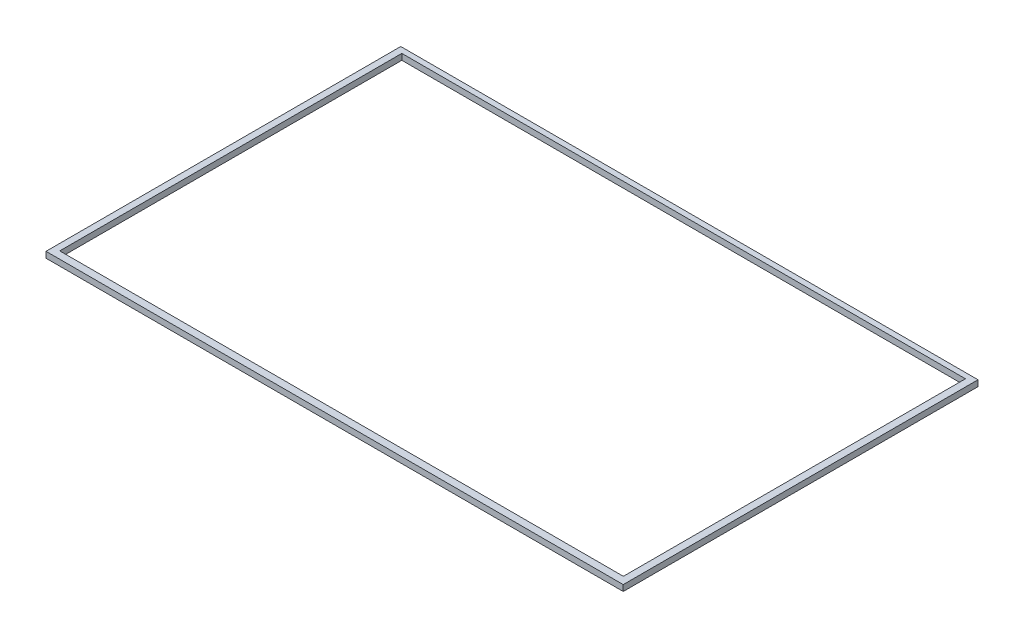
ISO-10303-21;
HEADER;
FILE_DESCRIPTION(('STEP AP214'),'2;1');
FILE_NAME('part.step','',(''),(''),'','','');
FILE_SCHEMA(('AUTOMOTIVE_DESIGN { 1 0 10303 214 1 1 1 1 }'));
ENDSEC;
DATA;
#1=APPLICATION_CONTEXT('core data for automotive mechanical design processes');
#2=APPLICATION_PROTOCOL_DEFINITION('international standard','automotive_design',2000,#1);
#3=PRODUCT_CONTEXT('',#1,'mechanical');
#4=PRODUCT('Part','Part','',(#3));
#5=PRODUCT_RELATED_PRODUCT_CATEGORY('part','',(#4));
#6=PRODUCT_DEFINITION_FORMATION('','',#4);
#7=PRODUCT_DEFINITION_CONTEXT('part definition',#1,'design');
#8=PRODUCT_DEFINITION('design','',#6,#7);
#9=PRODUCT_DEFINITION_SHAPE('','',#8);
#10=(LENGTH_UNIT() NAMED_UNIT(*) SI_UNIT(.MILLI.,.METRE.));
#11=(NAMED_UNIT(*) PLANE_ANGLE_UNIT() SI_UNIT($,.RADIAN.));
#12=(NAMED_UNIT(*) SI_UNIT($,.STERADIAN.) SOLID_ANGLE_UNIT());
#13=UNCERTAINTY_MEASURE_WITH_UNIT(LENGTH_MEASURE(1.E-05),#10,'distance_accuracy_value','');
#14=(GEOMETRIC_REPRESENTATION_CONTEXT(3) GLOBAL_UNCERTAINTY_ASSIGNED_CONTEXT((#13)) GLOBAL_UNIT_ASSIGNED_CONTEXT((#10,
#11,#12)) REPRESENTATION_CONTEXT('',''));
#15=CARTESIAN_POINT('',(0.,0.,0.));
#16=DIRECTION('',(0.,0.,1.));
#17=DIRECTION('',(1.,0.,0.));
#18=AXIS2_PLACEMENT_3D('',#15,#16,#17);
#19=CARTESIAN_POINT('',(0.,1.5875,0.));
#20=DIRECTION('',(0.,-1.,0.));
#21=DIRECTION('',(0.,0.,-1.));
#22=AXIS2_PLACEMENT_3D('',#19,#20,#21);
#23=PLANE('',#22);
#24=DIRECTION('',(0.,0.,1.));
#25=VECTOR('',#24,1.);
#26=CARTESIAN_POINT('',(0.,1.5875,0.));
#27=LINE('',#26,#25);
#28=CARTESIAN_POINT('',(0.,1.5875,-93.6625));
#29=VERTEX_POINT('',#28);
#30=CARTESIAN_POINT('',(0.,1.5875,0.));
#31=VERTEX_POINT('',#30);
#32=EDGE_CURVE('E134',#29,#31,#27,.T.);
#33=ORIENTED_EDGE('',*,*,#32,.T.);
#34=DIRECTION('',(1.,0.,0.));
#35=VECTOR('',#34,1.);
#36=CARTESIAN_POINT('',(0.,1.5875,0.));
#37=LINE('',#36,#35);
#38=CARTESIAN_POINT('',(152.4,1.5875,0.));
#39=VERTEX_POINT('',#38);
#40=EDGE_CURVE('E137',#31,#39,#37,.T.);
#41=ORIENTED_EDGE('',*,*,#40,.T.);
#42=DIRECTION('',(0.,0.,-1.));
#43=VECTOR('',#42,1.);
#44=CARTESIAN_POINT('',(152.4,1.5875,0.));
#45=LINE('',#44,#43);
#46=CARTESIAN_POINT('',(152.4,1.5875,-93.6625));
#47=VERTEX_POINT('',#46);
#48=EDGE_CURVE('E140',#39,#47,#45,.T.);
#49=ORIENTED_EDGE('',*,*,#48,.T.);
#50=DIRECTION('',(-1.,0.,0.));
#51=VECTOR('',#50,1.);
#52=CARTESIAN_POINT('',(0.,1.5875,-93.6625));
#53=LINE('',#52,#51);
#54=EDGE_CURVE('E142',#47,#29,#53,.T.);
#55=ORIENTED_EDGE('',*,*,#54,.T.);
#56=EDGE_LOOP('',(#33,#41,#49,#55));
#57=FACE_BOUND('',#56,.T.);
#58=DIRECTION('',(0.,0.,-1.));
#59=VECTOR('',#58,1.);
#60=CARTESIAN_POINT('',(150.523826926843,1.5875,-1.90767106637114));
#61=LINE('',#60,#59);
#62=CARTESIAN_POINT('',(150.523826926843,1.5875,-1.90767106637114));
#63=VERTEX_POINT('',#62);
#64=CARTESIAN_POINT('',(150.523826926843,1.5875,-92.2252329015203));
#65=VERTEX_POINT('',#64);
#66=EDGE_CURVE('E98',#63,#65,#61,.T.);
#67=ORIENTED_EDGE('',*,*,#66,.F.);
#68=DIRECTION('',(1.,0.,0.));
#69=VECTOR('',#68,1.);
#70=CARTESIAN_POINT('',(150.523826926843,1.5875,-1.90767106637114));
#71=LINE('',#70,#69);
#72=CARTESIAN_POINT('',(1.71937175052689,1.5875,-1.90767106637114));
#73=VERTEX_POINT('',#72);
#74=EDGE_CURVE('E120',#73,#63,#71,.T.);
#75=ORIENTED_EDGE('',*,*,#74,.F.);
#76=DIRECTION('',(0.,0.,1.));
#77=VECTOR('',#76,1.);
#78=CARTESIAN_POINT('',(1.71937175052689,1.5875,-1.90767106637114));
#79=LINE('',#78,#77);
#80=CARTESIAN_POINT('',(1.71937175052689,1.5875,-92.2252329015203));
#81=VERTEX_POINT('',#80);
#82=EDGE_CURVE('E118',#81,#73,#79,.T.);
#83=ORIENTED_EDGE('',*,*,#82,.F.);
#84=DIRECTION('',(-1.,0.,0.));
#85=VECTOR('',#84,1.);
#86=CARTESIAN_POINT('',(150.523826926843,1.5875,-92.2252329015203));
#87=LINE('',#86,#85);
#88=EDGE_CURVE('E106',#65,#81,#87,.T.);
#89=ORIENTED_EDGE('',*,*,#88,.F.);
#90=EDGE_LOOP('',(#67,#75,#83,#89));
#91=FACE_BOUND('',#90,.T.);
#92=ADVANCED_FACE('F33',(#57,#91),#23,.F.);
#93=CARTESIAN_POINT('',(0.,0.,0.));
#94=DIRECTION('',(0.,-1.,0.));
#95=DIRECTION('',(0.,0.,-1.));
#96=AXIS2_PLACEMENT_3D('',#93,#94,#95);
#97=PLANE('',#96);
#98=DIRECTION('',(0.,0.,1.));
#99=VECTOR('',#98,1.);
#100=CARTESIAN_POINT('',(0.,0.,0.));
#101=LINE('',#100,#99);
#102=CARTESIAN_POINT('',(0.,0.,-93.6625));
#103=VERTEX_POINT('',#102);
#104=CARTESIAN_POINT('',(0.,0.,0.));
#105=VERTEX_POINT('',#104);
#106=EDGE_CURVE('E114',#103,#105,#101,.T.);
#107=ORIENTED_EDGE('',*,*,#106,.F.);
#108=DIRECTION('',(-1.,0.,0.));
#109=VECTOR('',#108,1.);
#110=CARTESIAN_POINT('',(0.,0.,-93.6625));
#111=LINE('',#110,#109);
#112=CARTESIAN_POINT('',(152.4,0.,-93.6625));
#113=VERTEX_POINT('',#112);
#114=EDGE_CURVE('E138',#113,#103,#111,.T.);
#115=ORIENTED_EDGE('',*,*,#114,.F.);
#116=DIRECTION('',(0.,0.,-1.));
#117=VECTOR('',#116,1.);
#118=CARTESIAN_POINT('',(152.4,0.,0.));
#119=LINE('',#118,#117);
#120=CARTESIAN_POINT('',(152.4,0.,0.));
#121=VERTEX_POINT('',#120);
#122=EDGE_CURVE('E149',#121,#113,#119,.T.);
#123=ORIENTED_EDGE('',*,*,#122,.F.);
#124=DIRECTION('',(1.,0.,0.));
#125=VECTOR('',#124,1.);
#126=CARTESIAN_POINT('',(0.,0.,0.));
#127=LINE('',#126,#125);
#128=EDGE_CURVE('E147',#105,#121,#127,.T.);
#129=ORIENTED_EDGE('',*,*,#128,.F.);
#130=EDGE_LOOP('',(#107,#115,#123,#129));
#131=FACE_BOUND('',#130,.T.);
#132=DIRECTION('',(1.,0.,0.));
#133=VECTOR('',#132,1.);
#134=CARTESIAN_POINT('',(150.523826926843,0.,-1.90767106637114));
#135=LINE('',#134,#133);
#136=CARTESIAN_POINT('',(1.71937175052689,0.,-1.90767106637114));
#137=VERTEX_POINT('',#136);
#138=CARTESIAN_POINT('',(150.523826926843,0.,-1.90767106637114));
#139=VERTEX_POINT('',#138);
#140=EDGE_CURVE('E107',#137,#139,#135,.T.);
#141=ORIENTED_EDGE('',*,*,#140,.T.);
#142=DIRECTION('',(0.,0.,-1.));
#143=VECTOR('',#142,1.);
#144=CARTESIAN_POINT('',(150.523826926843,0.,-1.90767106637114));
#145=LINE('',#144,#143);
#146=CARTESIAN_POINT('',(150.523826926843,0.,-92.2252329015203));
#147=VERTEX_POINT('',#146);
#148=EDGE_CURVE('E56',#139,#147,#145,.T.);
#149=ORIENTED_EDGE('',*,*,#148,.T.);
#150=DIRECTION('',(-1.,0.,0.));
#151=VECTOR('',#150,1.);
#152=CARTESIAN_POINT('',(150.523826926843,0.,-92.2252329015203));
#153=LINE('',#152,#151);
#154=CARTESIAN_POINT('',(1.71937175052689,0.,-92.2252329015203));
#155=VERTEX_POINT('',#154);
#156=EDGE_CURVE('E113',#147,#155,#153,.T.);
#157=ORIENTED_EDGE('',*,*,#156,.T.);
#158=DIRECTION('',(0.,0.,1.));
#159=VECTOR('',#158,1.);
#160=CARTESIAN_POINT('',(1.71937175052689,0.,-1.90767106637114));
#161=LINE('',#160,#159);
#162=EDGE_CURVE('E126',#155,#137,#161,.T.);
#163=ORIENTED_EDGE('',*,*,#162,.T.);
#164=EDGE_LOOP('',(#141,#149,#157,#163));
#165=FACE_BOUND('',#164,.T.);
#166=ADVANCED_FACE('F167',(#131,#165),#97,.T.);
#167=CARTESIAN_POINT('',(0.,1.5875,0.));
#168=DIRECTION('',(1.,0.,0.));
#169=DIRECTION('',(0.,0.,-1.));
#170=AXIS2_PLACEMENT_3D('',#167,#168,#169);
#171=PLANE('',#170);
#172=ORIENTED_EDGE('',*,*,#106,.T.);
#173=DIRECTION('',(0.,-1.,0.));
#174=VECTOR('',#173,1.);
#175=CARTESIAN_POINT('',(0.,1.5875,0.));
#176=LINE('',#175,#174);
#177=EDGE_CURVE('E11',#31,#105,#176,.T.);
#178=ORIENTED_EDGE('',*,*,#177,.F.);
#179=ORIENTED_EDGE('',*,*,#32,.F.);
#180=DIRECTION('',(0.,-1.,0.));
#181=VECTOR('',#180,1.);
#182=CARTESIAN_POINT('',(0.,1.5875,-93.6625));
#183=LINE('',#182,#181);
#184=EDGE_CURVE('E144',#29,#103,#183,.T.);
#185=ORIENTED_EDGE('',*,*,#184,.T.);
#186=EDGE_LOOP('',(#172,#178,#179,#185));
#187=FACE_BOUND('',#186,.T.);
#188=ADVANCED_FACE('F35',(#187),#171,.F.);
#189=CARTESIAN_POINT('',(0.,1.5875,0.));
#190=DIRECTION('',(0.,0.,-1.));
#191=DIRECTION('',(-1.,0.,0.));
#192=AXIS2_PLACEMENT_3D('',#189,#190,#191);
#193=PLANE('',#192);
#194=ORIENTED_EDGE('',*,*,#128,.T.);
#195=DIRECTION('',(0.,-1.,0.));
#196=VECTOR('',#195,1.);
#197=CARTESIAN_POINT('',(152.4,1.5875,0.));
#198=LINE('',#197,#196);
#199=EDGE_CURVE('E41',#39,#121,#198,.T.);
#200=ORIENTED_EDGE('',*,*,#199,.F.);
#201=ORIENTED_EDGE('',*,*,#40,.F.);
#202=ORIENTED_EDGE('',*,*,#177,.T.);
#203=EDGE_LOOP('',(#194,#200,#201,#202));
#204=FACE_BOUND('',#203,.T.);
#205=ADVANCED_FACE('F177',(#204),#193,.F.);
#206=CARTESIAN_POINT('',(152.4,1.5875,0.));
#207=DIRECTION('',(-1.,0.,0.));
#208=DIRECTION('',(0.,0.,1.));
#209=AXIS2_PLACEMENT_3D('',#206,#207,#208);
#210=PLANE('',#209);
#211=ORIENTED_EDGE('',*,*,#122,.T.);
#212=DIRECTION('',(0.,-1.,0.));
#213=VECTOR('',#212,1.);
#214=CARTESIAN_POINT('',(152.4,1.5875,-93.6625));
#215=LINE('',#214,#213);
#216=EDGE_CURVE('E154',#47,#113,#215,.T.);
#217=ORIENTED_EDGE('',*,*,#216,.F.);
#218=ORIENTED_EDGE('',*,*,#48,.F.);
#219=ORIENTED_EDGE('',*,*,#199,.T.);
#220=EDGE_LOOP('',(#211,#217,#218,#219));
#221=FACE_BOUND('',#220,.T.);
#222=ADVANCED_FACE('F161',(#221),#210,.F.);
#223=CARTESIAN_POINT('',(0.,1.5875,-93.6625));
#224=DIRECTION('',(0.,0.,1.));
#225=DIRECTION('',(1.,0.,0.));
#226=AXIS2_PLACEMENT_3D('',#223,#224,#225);
#227=PLANE('',#226);
#228=ORIENTED_EDGE('',*,*,#114,.T.);
#229=ORIENTED_EDGE('',*,*,#184,.F.);
#230=ORIENTED_EDGE('',*,*,#54,.F.);
#231=ORIENTED_EDGE('',*,*,#216,.T.);
#232=EDGE_LOOP('',(#228,#229,#230,#231));
#233=FACE_BOUND('',#232,.T.);
#234=ADVANCED_FACE('F171',(#233),#227,.F.);
#235=CARTESIAN_POINT('',(150.523826926843,1.5875,-1.90767106637114));
#236=DIRECTION('',(-1.,0.,0.));
#237=DIRECTION('',(0.,0.,1.));
#238=AXIS2_PLACEMENT_3D('',#235,#236,#237);
#239=PLANE('',#238);
#240=ORIENTED_EDGE('',*,*,#148,.F.);
#241=DIRECTION('',(0.,-1.,0.));
#242=VECTOR('',#241,1.);
#243=CARTESIAN_POINT('',(150.523826926843,1.5875,-1.90767106637114));
#244=LINE('',#243,#242);
#245=EDGE_CURVE('E102',#63,#139,#244,.T.);
#246=ORIENTED_EDGE('',*,*,#245,.F.);
#247=ORIENTED_EDGE('',*,*,#66,.T.);
#248=DIRECTION('',(0.,-1.,0.));
#249=VECTOR('',#248,1.);
#250=CARTESIAN_POINT('',(150.523826926843,1.5875,-92.2252329015203));
#251=LINE('',#250,#249);
#252=EDGE_CURVE('E101',#65,#147,#251,.T.);
#253=ORIENTED_EDGE('',*,*,#252,.T.);
#254=EDGE_LOOP('',(#240,#246,#247,#253));
#255=FACE_BOUND('',#254,.T.);
#256=ADVANCED_FACE('F100',(#255),#239,.T.);
#257=CARTESIAN_POINT('',(150.523826926843,1.5875,-92.2252329015203));
#258=DIRECTION('',(0.,0.,1.));
#259=DIRECTION('',(1.,0.,0.));
#260=AXIS2_PLACEMENT_3D('',#257,#258,#259);
#261=PLANE('',#260);
#262=ORIENTED_EDGE('',*,*,#156,.F.);
#263=ORIENTED_EDGE('',*,*,#252,.F.);
#264=ORIENTED_EDGE('',*,*,#88,.T.);
#265=DIRECTION('',(0.,-1.,0.));
#266=VECTOR('',#265,1.);
#267=CARTESIAN_POINT('',(1.71937175052689,1.5875,-92.2252329015203));
#268=LINE('',#267,#266);
#269=EDGE_CURVE('E115',#81,#155,#268,.T.);
#270=ORIENTED_EDGE('',*,*,#269,.T.);
#271=EDGE_LOOP('',(#262,#263,#264,#270));
#272=FACE_BOUND('',#271,.T.);
#273=ADVANCED_FACE('F110',(#272),#261,.T.);
#274=CARTESIAN_POINT('',(1.71937175052689,1.5875,-1.90767106637114));
#275=DIRECTION('',(1.,0.,0.));
#276=DIRECTION('',(0.,0.,-1.));
#277=AXIS2_PLACEMENT_3D('',#274,#275,#276);
#278=PLANE('',#277);
#279=ORIENTED_EDGE('',*,*,#162,.F.);
#280=ORIENTED_EDGE('',*,*,#269,.F.);
#281=ORIENTED_EDGE('',*,*,#82,.T.);
#282=DIRECTION('',(0.,-1.,0.));
#283=VECTOR('',#282,1.);
#284=CARTESIAN_POINT('',(1.71937175052689,1.5875,-1.90767106637114));
#285=LINE('',#284,#283);
#286=EDGE_CURVE('E48',#73,#137,#285,.T.);
#287=ORIENTED_EDGE('',*,*,#286,.T.);
#288=EDGE_LOOP('',(#279,#280,#281,#287));
#289=FACE_BOUND('',#288,.T.);
#290=ADVANCED_FACE('F200',(#289),#278,.T.);
#291=CARTESIAN_POINT('',(150.523826926843,1.5875,-1.90767106637114));
#292=DIRECTION('',(0.,0.,-1.));
#293=DIRECTION('',(-1.,0.,0.));
#294=AXIS2_PLACEMENT_3D('',#291,#292,#293);
#295=PLANE('',#294);
#296=ORIENTED_EDGE('',*,*,#140,.F.);
#297=ORIENTED_EDGE('',*,*,#286,.F.);
#298=ORIENTED_EDGE('',*,*,#74,.T.);
#299=ORIENTED_EDGE('',*,*,#245,.T.);
#300=EDGE_LOOP('',(#296,#297,#298,#299));
#301=FACE_BOUND('',#300,.T.);
#302=ADVANCED_FACE('F204',(#301),#295,.T.);
#303=CLOSED_SHELL('',(#92,#166,#188,#205,#222,#234,#256,#273,#290,#302));
#304=MANIFOLD_SOLID_BREP('B2',#303);
#305=ADVANCED_BREP_SHAPE_REPRESENTATION('',(#18,#304),#14);
#306=SHAPE_DEFINITION_REPRESENTATION(#9,#305);
ENDSEC;
END-ISO-10303-21;
